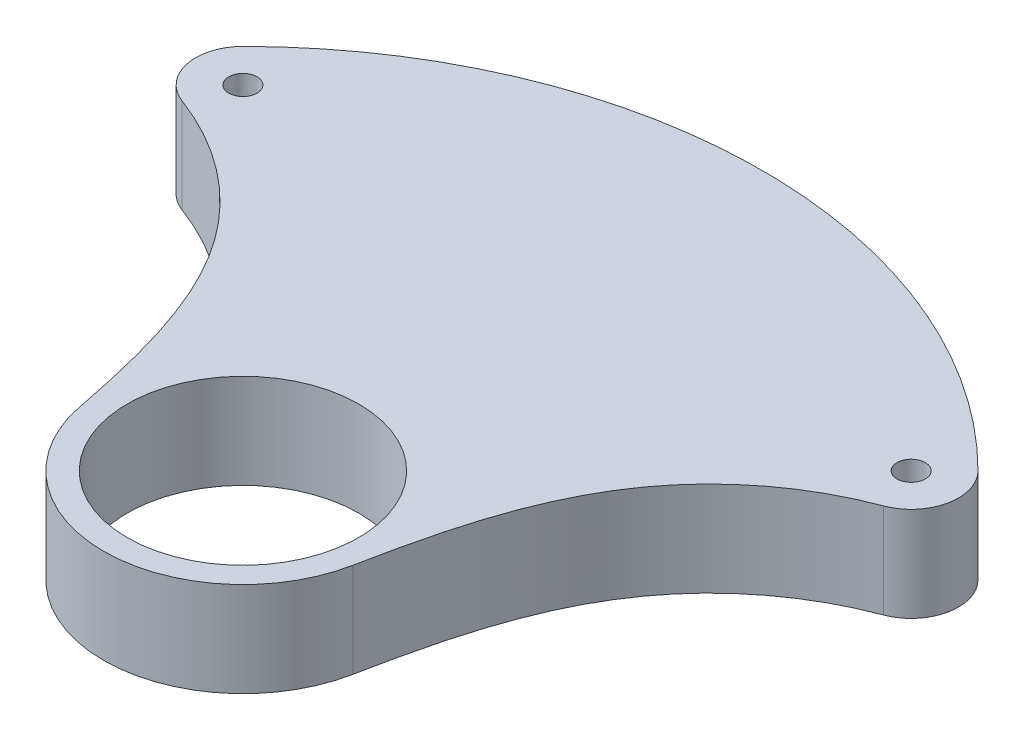
ISO-10303-21;
HEADER;
FILE_DESCRIPTION(('STEP AP214'),'2;1');
FILE_NAME('part.step','',(''),(''),'','','');
FILE_SCHEMA(('AUTOMOTIVE_DESIGN { 1 0 10303 214 1 1 1 1 }'));
ENDSEC;
DATA;
#1=APPLICATION_CONTEXT('core data for automotive mechanical design processes');
#2=APPLICATION_PROTOCOL_DEFINITION('international standard','automotive_design',2000,#1);
#3=PRODUCT_CONTEXT('',#1,'mechanical');
#4=PRODUCT('Part','Part','',(#3));
#5=PRODUCT_RELATED_PRODUCT_CATEGORY('part','',(#4));
#6=PRODUCT_DEFINITION_FORMATION('','',#4);
#7=PRODUCT_DEFINITION_CONTEXT('part definition',#1,'design');
#8=PRODUCT_DEFINITION('design','',#6,#7);
#9=PRODUCT_DEFINITION_SHAPE('','',#8);
#10=(LENGTH_UNIT() NAMED_UNIT(*) SI_UNIT(.MILLI.,.METRE.));
#11=(NAMED_UNIT(*) PLANE_ANGLE_UNIT() SI_UNIT($,.RADIAN.));
#12=(NAMED_UNIT(*) SI_UNIT($,.STERADIAN.) SOLID_ANGLE_UNIT());
#13=UNCERTAINTY_MEASURE_WITH_UNIT(LENGTH_MEASURE(1.E-05),#10,'distance_accuracy_value','');
#14=(GEOMETRIC_REPRESENTATION_CONTEXT(3) GLOBAL_UNCERTAINTY_ASSIGNED_CONTEXT((#13)) GLOBAL_UNIT_ASSIGNED_CONTEXT((#10,
#11,#12)) REPRESENTATION_CONTEXT('',''));
#15=CARTESIAN_POINT('',(0.,0.,0.));
#16=DIRECTION('',(0.,0.,1.));
#17=DIRECTION('',(1.,0.,0.));
#18=AXIS2_PLACEMENT_3D('',#15,#16,#17);
#19=CARTESIAN_POINT('',(35.3553390593274,10.,-35.3553390593273));
#20=DIRECTION('',(0.,-1.,0.));
#21=DIRECTION('',(0.,0.,-1.));
#22=AXIS2_PLACEMENT_3D('',#19,#20,#21);
#23=CYLINDRICAL_SURFACE('',#22,5.);
#24=CARTESIAN_POINT('',(35.3553390593274,0.,-35.3553390593273));
#25=DIRECTION('',(0.,1.,0.));
#26=DIRECTION('',(0.,0.,1.));
#27=AXIS2_PLACEMENT_3D('',#24,#25,#26);
#28=CIRCLE('',#27,5.);
#29=CARTESIAN_POINT('',(38.8908729652602,0.,-38.89087296526));
#30=VERTEX_POINT('',#29);
#31=CARTESIAN_POINT('',(37.1012695198472,0.,-30.6700720629834));
#32=VERTEX_POINT('',#31);
#33=EDGE_CURVE('E282',#30,#32,#28,.F.);
#34=ORIENTED_EDGE('',*,*,#33,.F.);
#35=DIRECTION('',(0.,-1.,0.));
#36=VECTOR('',#35,1.);
#37=CARTESIAN_POINT('',(38.8908729652602,10.,-38.89087296526));
#38=LINE('',#37,#36);
#39=CARTESIAN_POINT('',(38.8908729652602,10.,-38.89087296526));
#40=VERTEX_POINT('',#39);
#41=EDGE_CURVE('E162',#40,#30,#38,.T.);
#42=ORIENTED_EDGE('',*,*,#41,.F.);
#43=CARTESIAN_POINT('',(35.3553390593274,10.,-35.3553390593273));
#44=DIRECTION('',(0.,1.,0.));
#45=DIRECTION('',(0.,0.,1.));
#46=AXIS2_PLACEMENT_3D('',#43,#44,#45);
#47=CIRCLE('',#46,5.);
#48=CARTESIAN_POINT('',(37.1012695198472,10.,-30.6700720629834));
#49=VERTEX_POINT('',#48);
#50=EDGE_CURVE('E235',#40,#49,#47,.F.);
#51=ORIENTED_EDGE('',*,*,#50,.T.);
#52=DIRECTION('',(0.,-1.,0.));
#53=VECTOR('',#52,1.);
#54=CARTESIAN_POINT('',(37.1012695198472,10.,-30.6700720629834));
#55=LINE('',#54,#53);
#56=EDGE_CURVE('E12',#49,#32,#55,.T.);
#57=ORIENTED_EDGE('',*,*,#56,.T.);
#58=EDGE_LOOP('',(#34,#42,#51,#57));
#59=FACE_BOUND('',#58,.T.);
#60=ADVANCED_FACE('F152',(#59),#23,.T.);
#61=CARTESIAN_POINT('',(0.,10.,0.));
#62=DIRECTION('',(0.,-1.,0.));
#63=DIRECTION('',(0.,0.,-1.));
#64=AXIS2_PLACEMENT_3D('',#61,#62,#63);
#65=CYLINDRICAL_SURFACE('',#64,55.);
#66=CARTESIAN_POINT('',(0.,0.,0.));
#67=DIRECTION('',(0.,1.,0.));
#68=DIRECTION('',(0.,0.,1.));
#69=AXIS2_PLACEMENT_3D('',#66,#67,#68);
#70=CIRCLE('',#69,55.);
#71=CARTESIAN_POINT('',(-38.8908729652602,0.,-38.89087296526));
#72=VERTEX_POINT('',#71);
#73=EDGE_CURVE('E286',#30,#72,#70,.T.);
#74=ORIENTED_EDGE('',*,*,#73,.T.);
#75=DIRECTION('',(0.,-1.,0.));
#76=VECTOR('',#75,1.);
#77=CARTESIAN_POINT('',(-38.8908729652602,10.,-38.89087296526));
#78=LINE('',#77,#76);
#79=CARTESIAN_POINT('',(-38.8908729652602,10.,-38.89087296526));
#80=VERTEX_POINT('',#79);
#81=EDGE_CURVE('E220',#80,#72,#78,.T.);
#82=ORIENTED_EDGE('',*,*,#81,.F.);
#83=CARTESIAN_POINT('',(0.,10.,0.));
#84=DIRECTION('',(0.,1.,0.));
#85=DIRECTION('',(0.,0.,1.));
#86=AXIS2_PLACEMENT_3D('',#83,#84,#85);
#87=CIRCLE('',#86,55.);
#88=EDGE_CURVE('E229',#40,#80,#87,.T.);
#89=ORIENTED_EDGE('',*,*,#88,.F.);
#90=ORIENTED_EDGE('',*,*,#41,.T.);
#91=EDGE_LOOP('',(#74,#82,#89,#90));
#92=FACE_BOUND('',#91,.T.);
#93=ADVANCED_FACE('F253',(#92),#65,.T.);
#94=CARTESIAN_POINT('',(-37.1012695198472,10.,-30.6700720629834));
#95=CARTESIAN_POINT('',(-31.0879369971767,10.,-28.4292477025452));
#96=CARTESIAN_POINT('',(-19.5444117508886,10.,-19.3017262070138));
#97=CARTESIAN_POINT('',(-16.0485688950031,10.,-5.16921363176343));
#98=CARTESIAN_POINT('',(-14.4729681854976,10.,2.8452929377439));
#99=B_SPLINE_CURVE_WITH_KNOTS('',3,(#94,#95,#96,#97,#98),.UNSPECIFIED.,.F.,.F.,(4,1,4),(0.,
0.434164211750915,1.),.UNSPECIFIED.);
#100=DIRECTION('',(0.,-1.,0.));
#101=VECTOR('',#100,1.);
#102=SURFACE_OF_LINEAR_EXTRUSION('',#99,#101);
#103=CARTESIAN_POINT('',(-37.1012695198472,0.,-30.6700720629834));
#104=CARTESIAN_POINT('',(-31.0879369971767,0.,-28.4292477025452));
#105=CARTESIAN_POINT('',(-19.5444117508886,0.,-19.3017262070138));
#106=CARTESIAN_POINT('',(-16.0485688950031,0.,-5.16921363176343));
#107=CARTESIAN_POINT('',(-14.4729681854976,0.,2.8452929377439));
#108=B_SPLINE_CURVE_WITH_KNOTS('',3,(#103,#104,#105,#106,#107),.UNSPECIFIED.,.F.,.F.,(4,1,4),
(0.,0.434164211750915,1.),.UNSPECIFIED.);
#109=CARTESIAN_POINT('',(-37.1012695198472,0.,-30.6700720629834));
#110=VERTEX_POINT('',#109);
#111=CARTESIAN_POINT('',(-14.4729681854976,0.,2.84529293774389));
#112=VERTEX_POINT('',#111);
#113=EDGE_CURVE('E270',#110,#112,#108,.T.);
#114=ORIENTED_EDGE('',*,*,#113,.T.);
#115=DIRECTION('',(0.,-1.,0.));
#116=VECTOR('',#115,1.);
#117=CARTESIAN_POINT('',(-14.4729681854976,10.,2.84529293774389));
#118=LINE('',#117,#116);
#119=CARTESIAN_POINT('',(-14.4729681854976,10.,2.84529293774389));
#120=VERTEX_POINT('',#119);
#121=EDGE_CURVE('E190',#120,#112,#118,.T.);
#122=ORIENTED_EDGE('',*,*,#121,.F.);
#123=CARTESIAN_POINT('',(-37.1012695198472,10.,-30.6700720629834));
#124=VERTEX_POINT('',#123);
#125=EDGE_CURVE('E226',#124,#120,#99,.T.);
#126=ORIENTED_EDGE('',*,*,#125,.F.);
#127=DIRECTION('',(0.,-1.,0.));
#128=VECTOR('',#127,1.);
#129=CARTESIAN_POINT('',(-37.1012695198472,10.,-30.6700720629834));
#130=LINE('',#129,#128);
#131=EDGE_CURVE('E209',#124,#110,#130,.T.);
#132=ORIENTED_EDGE('',*,*,#131,.T.);
#133=EDGE_LOOP('',(#114,#122,#126,#132));
#134=FACE_BOUND('',#133,.T.);
#135=ADVANCED_FACE('F232',(#134),#102,.F.);
#136=CARTESIAN_POINT('',(37.1012695198472,10.,-30.6700720629834));
#137=CARTESIAN_POINT('',(31.0879369971767,10.,-28.4292477025452));
#138=CARTESIAN_POINT('',(19.5444117508886,10.,-19.3017262070138));
#139=CARTESIAN_POINT('',(16.0485688950031,10.,-5.16921363176343));
#140=CARTESIAN_POINT('',(14.4729681854976,10.,2.8452929377439));
#141=B_SPLINE_CURVE_WITH_KNOTS('',3,(#136,#137,#138,#139,#140),.UNSPECIFIED.,.F.,.F.,(4,1,4),
(0.,0.434164211750915,1.),.UNSPECIFIED.);
#142=DIRECTION('',(0.,-1.,0.));
#143=VECTOR('',#142,1.);
#144=SURFACE_OF_LINEAR_EXTRUSION('',#141,#143);
#145=CARTESIAN_POINT('',(37.1012695198472,0.,-30.6700720629834));
#146=CARTESIAN_POINT('',(31.0879369971767,0.,-28.4292477025452));
#147=CARTESIAN_POINT('',(19.5444117508886,0.,-19.3017262070138));
#148=CARTESIAN_POINT('',(16.0485688950031,0.,-5.16921363176343));
#149=CARTESIAN_POINT('',(14.4729681854976,0.,2.8452929377439));
#150=B_SPLINE_CURVE_WITH_KNOTS('',3,(#145,#146,#147,#148,#149),.UNSPECIFIED.,.F.,.F.,(4,1,4),
(0.,0.434164211750915,1.),.UNSPECIFIED.);
#151=CARTESIAN_POINT('',(14.4729681854976,0.,2.84529293774389));
#152=VERTEX_POINT('',#151);
#153=EDGE_CURVE('E230',#32,#152,#150,.T.);
#154=ORIENTED_EDGE('',*,*,#153,.F.);
#155=ORIENTED_EDGE('',*,*,#56,.F.);
#156=CARTESIAN_POINT('',(14.4729681854976,10.,2.84529293774389));
#157=VERTEX_POINT('',#156);
#158=EDGE_CURVE('E265',#49,#157,#141,.T.);
#159=ORIENTED_EDGE('',*,*,#158,.T.);
#160=DIRECTION('',(0.,-1.,0.));
#161=VECTOR('',#160,1.);
#162=CARTESIAN_POINT('',(14.4729681854976,10.,2.84529293774389));
#163=LINE('',#162,#161);
#164=EDGE_CURVE('E171',#157,#152,#163,.T.);
#165=ORIENTED_EDGE('',*,*,#164,.T.);
#166=EDGE_LOOP('',(#154,#155,#159,#165));
#167=FACE_BOUND('',#166,.T.);
#168=ADVANCED_FACE('F252',(#167),#144,.T.);
#169=CARTESIAN_POINT('',(0.,0.,0.));
#170=DIRECTION('',(0.,1.,0.));
#171=DIRECTION('',(0.,0.,1.));
#172=AXIS2_PLACEMENT_3D('',#169,#170,#171);
#173=PLANE('',#172);
#174=CARTESIAN_POINT('',(-35.3553390593274,0.,-35.3553390593273));
#175=DIRECTION('',(0.,1.,0.));
#176=DIRECTION('',(0.,0.,1.));
#177=AXIS2_PLACEMENT_3D('',#174,#175,#176);
#178=CIRCLE('',#177,1.5);
#179=CARTESIAN_POINT('',(-35.3553390593274,0.,-33.8553390593273));
#180=VERTEX_POINT('',#179);
#181=EDGE_CURVE('E304',#180,#180,#178,.F.);
#182=ORIENTED_EDGE('',*,*,#181,.F.);
#183=EDGE_LOOP('',(#182));
#184=FACE_BOUND('',#183,.T.);
#185=CARTESIAN_POINT('',(35.3553390593274,0.,-35.3553390593273));
#186=DIRECTION('',(0.,1.,0.));
#187=DIRECTION('',(0.,0.,1.));
#188=AXIS2_PLACEMENT_3D('',#185,#186,#187);
#189=CIRCLE('',#188,1.5);
#190=CARTESIAN_POINT('',(35.3553390593274,0.,-33.8553390593273));
#191=VERTEX_POINT('',#190);
#192=EDGE_CURVE('E337',#191,#191,#189,.F.);
#193=ORIENTED_EDGE('',*,*,#192,.F.);
#194=EDGE_LOOP('',(#193));
#195=FACE_BOUND('',#194,.T.);
#196=CARTESIAN_POINT('',(-35.3553390593274,0.,-35.3553390593273));
#197=DIRECTION('',(0.,1.,0.));
#198=DIRECTION('',(0.,0.,1.));
#199=AXIS2_PLACEMENT_3D('',#196,#197,#198);
#200=CIRCLE('',#199,5.);
#201=EDGE_CURVE('E215',#72,#110,#200,.T.);
#202=ORIENTED_EDGE('',*,*,#201,.F.);
#203=ORIENTED_EDGE('',*,*,#73,.F.);
#204=ORIENTED_EDGE('',*,*,#33,.T.);
#205=ORIENTED_EDGE('',*,*,#153,.T.);
#206=CARTESIAN_POINT('',(0.,0.,0.));
#207=DIRECTION('',(0.,1.,0.));
#208=DIRECTION('',(0.,0.,1.));
#209=AXIS2_PLACEMENT_3D('',#206,#207,#208);
#210=CIRCLE('',#209,14.75);
#211=EDGE_CURVE('E156',#112,#152,#210,.T.);
#212=ORIENTED_EDGE('',*,*,#211,.F.);
#213=ORIENTED_EDGE('',*,*,#113,.F.);
#214=EDGE_LOOP('',(#202,#203,#204,#205,#212,#213));
#215=FACE_BOUND('',#214,.T.);
#216=CARTESIAN_POINT('',(0.,0.,0.));
#217=DIRECTION('',(0.,1.,0.));
#218=DIRECTION('',(0.,0.,1.));
#219=AXIS2_PLACEMENT_3D('',#216,#217,#218);
#220=CIRCLE('',#219,12.25);
#221=CARTESIAN_POINT('',(0.,0.,12.25));
#222=VERTEX_POINT('',#221);
#223=EDGE_CURVE('E302',#222,#222,#220,.T.);
#224=ORIENTED_EDGE('',*,*,#223,.T.);
#225=EDGE_LOOP('',(#224));
#226=FACE_BOUND('',#225,.T.);
#227=ADVANCED_FACE('F254',(#184,#195,#215,#226),#173,.F.);
#228=CARTESIAN_POINT('',(0.,10.,0.));
#229=DIRECTION('',(0.,1.,0.));
#230=DIRECTION('',(0.,0.,1.));
#231=AXIS2_PLACEMENT_3D('',#228,#229,#230);
#232=PLANE('',#231);
#233=CARTESIAN_POINT('',(-35.3553390593274,10.,-35.3553390593273));
#234=DIRECTION('',(0.,1.,0.));
#235=DIRECTION('',(0.,0.,1.));
#236=AXIS2_PLACEMENT_3D('',#233,#234,#235);
#237=CIRCLE('',#236,1.5);
#238=CARTESIAN_POINT('',(-35.3553390593274,10.,-33.8553390593273));
#239=VERTEX_POINT('',#238);
#240=EDGE_CURVE('E332',#239,#239,#237,.T.);
#241=ORIENTED_EDGE('',*,*,#240,.F.);
#242=EDGE_LOOP('',(#241));
#243=FACE_BOUND('',#242,.T.);
#244=CARTESIAN_POINT('',(35.3553390593274,10.,-35.3553390593273));
#245=DIRECTION('',(0.,1.,0.));
#246=DIRECTION('',(0.,0.,-1.));
#247=AXIS2_PLACEMENT_3D('',#244,#245,#246);
#248=CIRCLE('',#247,1.5);
#249=CARTESIAN_POINT('',(35.3553390593274,10.,-36.8553390593273));
#250=VERTEX_POINT('',#249);
#251=EDGE_CURVE('E271',#250,#250,#248,.T.);
#252=ORIENTED_EDGE('',*,*,#251,.F.);
#253=EDGE_LOOP('',(#252));
#254=FACE_BOUND('',#253,.T.);
#255=ORIENTED_EDGE('',*,*,#88,.T.);
#256=CARTESIAN_POINT('',(-35.3553390593274,10.,-35.3553390593273));
#257=DIRECTION('',(0.,1.,0.));
#258=DIRECTION('',(0.,0.,1.));
#259=AXIS2_PLACEMENT_3D('',#256,#257,#258);
#260=CIRCLE('',#259,5.);
#261=EDGE_CURVE('E212',#80,#124,#260,.T.);
#262=ORIENTED_EDGE('',*,*,#261,.T.);
#263=ORIENTED_EDGE('',*,*,#125,.T.);
#264=CARTESIAN_POINT('',(0.,10.,0.));
#265=DIRECTION('',(0.,1.,0.));
#266=DIRECTION('',(0.,0.,1.));
#267=AXIS2_PLACEMENT_3D('',#264,#265,#266);
#268=CIRCLE('',#267,14.75);
#269=EDGE_CURVE('E278',#120,#157,#268,.T.);
#270=ORIENTED_EDGE('',*,*,#269,.T.);
#271=ORIENTED_EDGE('',*,*,#158,.F.);
#272=ORIENTED_EDGE('',*,*,#50,.F.);
#273=EDGE_LOOP('',(#255,#262,#263,#270,#271,#272));
#274=FACE_BOUND('',#273,.T.);
#275=CARTESIAN_POINT('',(0.,10.,0.));
#276=DIRECTION('',(0.,1.,0.));
#277=DIRECTION('',(0.,0.,1.));
#278=AXIS2_PLACEMENT_3D('',#275,#276,#277);
#279=CIRCLE('',#278,12.25);
#280=CARTESIAN_POINT('',(0.,10.,12.25));
#281=VERTEX_POINT('',#280);
#282=EDGE_CURVE('E299',#281,#281,#279,.T.);
#283=ORIENTED_EDGE('',*,*,#282,.F.);
#284=EDGE_LOOP('',(#283));
#285=FACE_BOUND('',#284,.T.);
#286=ADVANCED_FACE('F224',(#243,#254,#274,#285),#232,.T.);
#287=CARTESIAN_POINT('',(0.,10.,0.));
#288=DIRECTION('',(0.,-1.,0.));
#289=DIRECTION('',(0.,0.,-1.));
#290=AXIS2_PLACEMENT_3D('',#287,#288,#289);
#291=CYLINDRICAL_SURFACE('',#290,12.25);
#292=ORIENTED_EDGE('',*,*,#282,.T.);
#293=EDGE_LOOP('',(#292));
#294=FACE_BOUND('',#293,.T.);
#295=ORIENTED_EDGE('',*,*,#223,.F.);
#296=EDGE_LOOP('',(#295));
#297=FACE_BOUND('',#296,.T.);
#298=ADVANCED_FACE('F306',(#294,#297),#291,.F.);
#299=CARTESIAN_POINT('',(0.,10.,0.));
#300=DIRECTION('',(0.,-1.,0.));
#301=DIRECTION('',(0.,0.,-1.));
#302=AXIS2_PLACEMENT_3D('',#299,#300,#301);
#303=CYLINDRICAL_SURFACE('',#302,14.75);
#304=ORIENTED_EDGE('',*,*,#164,.F.);
#305=ORIENTED_EDGE('',*,*,#269,.F.);
#306=ORIENTED_EDGE('',*,*,#121,.T.);
#307=ORIENTED_EDGE('',*,*,#211,.T.);
#308=EDGE_LOOP('',(#304,#305,#306,#307));
#309=FACE_BOUND('',#308,.T.);
#310=ADVANCED_FACE('F154',(#309),#303,.T.);
#311=CARTESIAN_POINT('',(-35.3553390593274,10.,-35.3553390593273));
#312=DIRECTION('',(0.,-1.,0.));
#313=DIRECTION('',(0.,0.,-1.));
#314=AXIS2_PLACEMENT_3D('',#311,#312,#313);
#315=CYLINDRICAL_SURFACE('',#314,5.);
#316=ORIENTED_EDGE('',*,*,#131,.F.);
#317=ORIENTED_EDGE('',*,*,#261,.F.);
#318=ORIENTED_EDGE('',*,*,#81,.T.);
#319=ORIENTED_EDGE('',*,*,#201,.T.);
#320=EDGE_LOOP('',(#316,#317,#318,#319));
#321=FACE_BOUND('',#320,.T.);
#322=ADVANCED_FACE('F211',(#321),#315,.T.);
#323=CARTESIAN_POINT('',(35.3553390593274,-0.000999999999999265,-35.3553390593273));
#324=DIRECTION('',(0.,1.,0.));
#325=DIRECTION('',(0.,0.,1.));
#326=AXIS2_PLACEMENT_3D('',#323,#324,#325);
#327=CYLINDRICAL_SURFACE('',#326,1.5);
#328=ORIENTED_EDGE('',*,*,#251,.T.);
#329=EDGE_LOOP('',(#328));
#330=FACE_BOUND('',#329,.T.);
#331=ORIENTED_EDGE('',*,*,#192,.T.);
#332=EDGE_LOOP('',(#331));
#333=FACE_BOUND('',#332,.T.);
#334=ADVANCED_FACE('F311',(#330,#333),#327,.F.);
#335=CARTESIAN_POINT('',(-35.3553390593274,-0.000999999999999265,-35.3553390593273));
#336=DIRECTION('',(0.,1.,0.));
#337=DIRECTION('',(0.,0.,1.));
#338=AXIS2_PLACEMENT_3D('',#335,#336,#337);
#339=CYLINDRICAL_SURFACE('',#338,1.5);
#340=ORIENTED_EDGE('',*,*,#240,.T.);
#341=EDGE_LOOP('',(#340));
#342=FACE_BOUND('',#341,.T.);
#343=ORIENTED_EDGE('',*,*,#181,.T.);
#344=EDGE_LOOP('',(#343));
#345=FACE_BOUND('',#344,.T.);
#346=ADVANCED_FACE('F324',(#342,#345),#339,.F.);
#347=CLOSED_SHELL('',(#60,#93,#135,#168,#227,#286,#298,#310,#322,#334,#346));
#348=MANIFOLD_SOLID_BREP('B2',#347);
#349=ADVANCED_BREP_SHAPE_REPRESENTATION('',(#18,#348),#14);
#350=SHAPE_DEFINITION_REPRESENTATION(#9,#349);
ENDSEC;
END-ISO-10303-21;
